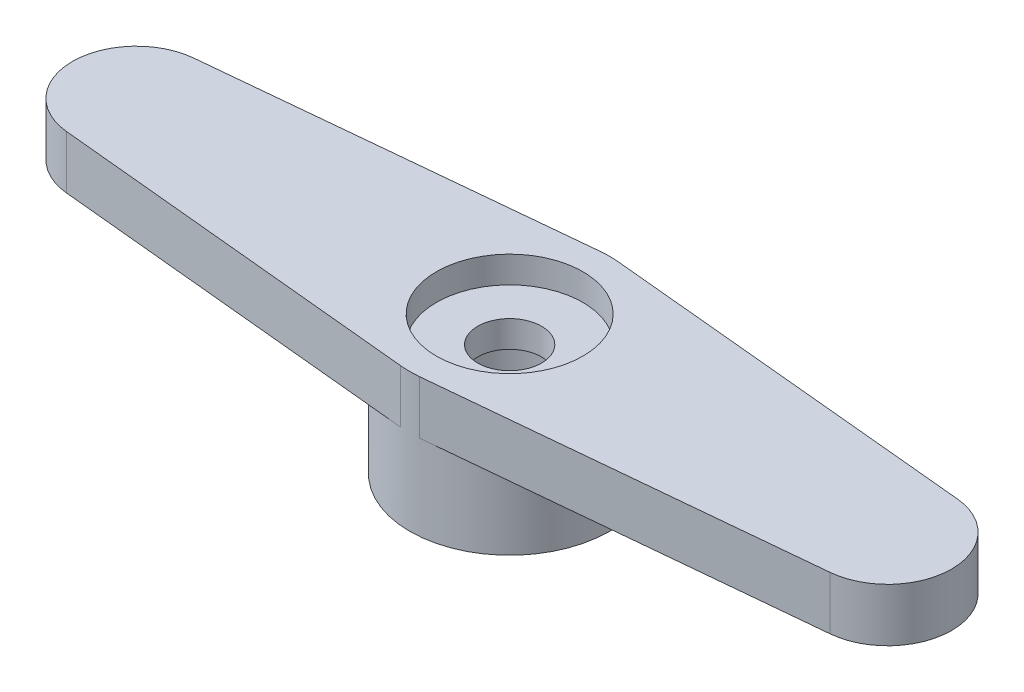
ISO-10303-21;
HEADER;
FILE_DESCRIPTION(('STEP AP214'),'2;1');
FILE_NAME('part.step','',(''),(''),'','','');
FILE_SCHEMA(('AUTOMOTIVE_DESIGN { 1 0 10303 214 1 1 1 1 }'));
ENDSEC;
DATA;
#1=APPLICATION_CONTEXT('core data for automotive mechanical design processes');
#2=APPLICATION_PROTOCOL_DEFINITION('international standard','automotive_design',2000,#1);
#3=PRODUCT_CONTEXT('',#1,'mechanical');
#4=PRODUCT('Part','Part','',(#3));
#5=PRODUCT_RELATED_PRODUCT_CATEGORY('part','',(#4));
#6=PRODUCT_DEFINITION_FORMATION('','',#4);
#7=PRODUCT_DEFINITION_CONTEXT('part definition',#1,'design');
#8=PRODUCT_DEFINITION('design','',#6,#7);
#9=PRODUCT_DEFINITION_SHAPE('','',#8);
#10=(LENGTH_UNIT() NAMED_UNIT(*) SI_UNIT(.MILLI.,.METRE.));
#11=(NAMED_UNIT(*) PLANE_ANGLE_UNIT() SI_UNIT($,.RADIAN.));
#12=(NAMED_UNIT(*) SI_UNIT($,.STERADIAN.) SOLID_ANGLE_UNIT());
#13=UNCERTAINTY_MEASURE_WITH_UNIT(LENGTH_MEASURE(1.E-05),#10,'distance_accuracy_value','');
#14=(GEOMETRIC_REPRESENTATION_CONTEXT(3) GLOBAL_UNCERTAINTY_ASSIGNED_CONTEXT((#13)) GLOBAL_UNIT_ASSIGNED_CONTEXT((#10,
#11,#12)) REPRESENTATION_CONTEXT('',''));
#15=CARTESIAN_POINT('',(0.,0.,0.));
#16=DIRECTION('',(0.,0.,1.));
#17=DIRECTION('',(1.,0.,0.));
#18=AXIS2_PLACEMENT_3D('',#15,#16,#17);
#19=CARTESIAN_POINT('',(0.,2.,0.));
#20=DIRECTION('',(0.,-1.,0.));
#21=DIRECTION('',(0.,0.,-1.));
#22=AXIS2_PLACEMENT_3D('',#19,#20,#21);
#23=CYLINDRICAL_SURFACE('',#22,1.2);
#24=CARTESIAN_POINT('',(0.,0.,0.));
#25=DIRECTION('',(0.,1.,0.));
#26=DIRECTION('',(0.,0.,1.));
#27=AXIS2_PLACEMENT_3D('',#24,#25,#26);
#28=CIRCLE('',#27,1.2);
#29=CARTESIAN_POINT('',(0.,0.,1.2));
#30=VERTEX_POINT('',#29);
#31=EDGE_CURVE('E184',#30,#30,#28,.T.);
#32=ORIENTED_EDGE('',*,*,#31,.F.);
#33=EDGE_LOOP('',(#32));
#34=FACE_BOUND('',#33,.T.);
#35=CARTESIAN_POINT('',(0.,1.,0.));
#36=DIRECTION('',(0.,1.,0.));
#37=DIRECTION('',(0.,0.,1.));
#38=AXIS2_PLACEMENT_3D('',#35,#36,#37);
#39=CIRCLE('',#38,1.2);
#40=CARTESIAN_POINT('',(0.,1.,1.2));
#41=VERTEX_POINT('',#40);
#42=EDGE_CURVE('E47',#41,#41,#39,.T.);
#43=ORIENTED_EDGE('',*,*,#42,.T.);
#44=EDGE_LOOP('',(#43));
#45=FACE_BOUND('',#44,.T.);
#46=ADVANCED_FACE('F43',(#34,#45),#23,.F.);
#47=CARTESIAN_POINT('',(14.2,0.,0.));
#48=DIRECTION('',(0.,1.,0.));
#49=DIRECTION('',(0.,0.,1.));
#50=AXIS2_PLACEMENT_3D('',#47,#48,#49);
#51=PLANE('',#50);
#52=CARTESIAN_POINT('',(0.,0.,0.));
#53=DIRECTION('',(0.,-1.,0.));
#54=DIRECTION('',(0.,0.,-1.));
#55=AXIS2_PLACEMENT_3D('',#52,#53,#54);
#56=CIRCLE('',#55,3.75);
#57=CARTESIAN_POINT('',(0.356514084507042,0.,-3.73301456031826));
#58=VERTEX_POINT('',#57);
#59=CARTESIAN_POINT('',(0.356514084507043,0.,3.73301456031826));
#60=VERTEX_POINT('',#59);
#61=EDGE_CURVE('E56',#58,#60,#56,.T.);
#62=ORIENTED_EDGE('',*,*,#61,.F.);
#63=DIRECTION('',(-0.995470549418202,0.,-0.0950704225352113));
#64=VECTOR('',#63,1.);
#65=CARTESIAN_POINT('',(0.356514084507042,0.,-3.73301456031826));
#66=LINE('',#65,#64);
#67=CARTESIAN_POINT('',(14.4281690140845,0.,-2.38912931860368));
#68=VERTEX_POINT('',#67);
#69=EDGE_CURVE('E151',#68,#58,#66,.T.);
#70=ORIENTED_EDGE('',*,*,#69,.F.);
#71=CARTESIAN_POINT('',(14.2,0.,0.));
#72=DIRECTION('',(0.,1.,0.));
#73=DIRECTION('',(0.,0.,1.));
#74=AXIS2_PLACEMENT_3D('',#71,#72,#73);
#75=CIRCLE('',#74,2.4);
#76=CARTESIAN_POINT('',(14.4281690140845,0.,2.38912931860368));
#77=VERTEX_POINT('',#76);
#78=EDGE_CURVE('E147',#77,#68,#75,.T.);
#79=ORIENTED_EDGE('',*,*,#78,.F.);
#80=DIRECTION('',(0.995470549418202,0.,-0.0950704225352114));
#81=VECTOR('',#80,1.);
#82=CARTESIAN_POINT('',(0.356514084507042,0.,3.73301456031826));
#83=LINE('',#82,#81);
#84=EDGE_CURVE('E91',#60,#77,#83,.T.);
#85=ORIENTED_EDGE('',*,*,#84,.F.);
#86=EDGE_LOOP('',(#62,#70,#79,#85));
#87=FACE_BOUND('',#86,.T.);
#88=ADVANCED_FACE('F234',(#87),#51,.F.);
#89=CARTESIAN_POINT('',(-0.360998998004985,0.,3.73258351861541));
#90=VERTEX_POINT('',#89);
#91=CARTESIAN_POINT('',(-0.360998998004984,0.,-3.73258351861541));
#92=VERTEX_POINT('',#91);
#93=EDGE_CURVE('E11',#90,#92,#56,.T.);
#94=ORIENTED_EDGE('',*,*,#93,.F.);
#95=DIRECTION('',(0.995355604964109,0.,0.096266399467996));
#96=VECTOR('',#95,1.);
#97=CARTESIAN_POINT('',(-0.360998998004985,0.,3.73258351861541));
#98=LINE('',#97,#96);
#99=CARTESIAN_POINT('',(-14.2546239890885,0.,2.38885345191386));
#100=VERTEX_POINT('',#99);
#101=EDGE_CURVE('E131',#100,#90,#98,.T.);
#102=ORIENTED_EDGE('',*,*,#101,.F.);
#103=CARTESIAN_POINT('',(-14.0235846303653,0.,0.));
#104=DIRECTION('',(0.,1.,0.));
#105=DIRECTION('',(0.,0.,1.));
#106=AXIS2_PLACEMENT_3D('',#103,#104,#105);
#107=CIRCLE('',#106,2.4);
#108=CARTESIAN_POINT('',(-14.2546239890885,0.,-2.38885345191386));
#109=VERTEX_POINT('',#108);
#110=EDGE_CURVE('E84',#109,#100,#107,.T.);
#111=ORIENTED_EDGE('',*,*,#110,.F.);
#112=DIRECTION('',(-0.995355604964109,0.,0.0962663994679961));
#113=VECTOR('',#112,1.);
#114=CARTESIAN_POINT('',(-14.2546239890885,0.,-2.38885345191386));
#115=LINE('',#114,#113);
#116=EDGE_CURVE('E156',#92,#109,#115,.T.);
#117=ORIENTED_EDGE('',*,*,#116,.F.);
#118=EDGE_LOOP('',(#94,#102,#111,#117));
#119=FACE_BOUND('',#118,.T.);
#120=ADVANCED_FACE('F225',(#119),#51,.F.);
#121=CARTESIAN_POINT('',(14.2,2.,0.));
#122=DIRECTION('',(0.,1.,0.));
#123=DIRECTION('',(0.,0.,1.));
#124=AXIS2_PLACEMENT_3D('',#121,#122,#123);
#125=PLANE('',#124);
#126=CARTESIAN_POINT('',(0.,2.,0.));
#127=DIRECTION('',(0.,1.,0.));
#128=DIRECTION('',(0.,0.,1.));
#129=AXIS2_PLACEMENT_3D('',#126,#127,#128);
#130=CIRCLE('',#129,2.75);
#131=CARTESIAN_POINT('',(0.,2.,2.75));
#132=VERTEX_POINT('',#131);
#133=EDGE_CURVE('E267',#132,#132,#130,.T.);
#134=ORIENTED_EDGE('',*,*,#133,.F.);
#135=EDGE_LOOP('',(#134));
#136=FACE_BOUND('',#135,.T.);
#137=CARTESIAN_POINT('',(14.2,2.,0.));
#138=DIRECTION('',(0.,1.,0.));
#139=DIRECTION('',(0.,0.,1.));
#140=AXIS2_PLACEMENT_3D('',#137,#138,#139);
#141=CIRCLE('',#140,2.4);
#142=CARTESIAN_POINT('',(14.4281690140845,2.,2.38912931860368));
#143=VERTEX_POINT('',#142);
#144=CARTESIAN_POINT('',(14.4281690140845,2.,-2.38912931860368));
#145=VERTEX_POINT('',#144);
#146=EDGE_CURVE('E165',#143,#145,#141,.T.);
#147=ORIENTED_EDGE('',*,*,#146,.T.);
#148=DIRECTION('',(-0.995470549418202,0.,-0.0950704225352113));
#149=VECTOR('',#148,1.);
#150=CARTESIAN_POINT('',(0.356514084507042,2.,-3.73301456031826));
#151=LINE('',#150,#149);
#152=CARTESIAN_POINT('',(0.356514084507042,2.,-3.73301456031826));
#153=VERTEX_POINT('',#152);
#154=EDGE_CURVE('E100',#145,#153,#151,.T.);
#155=ORIENTED_EDGE('',*,*,#154,.T.);
#156=CARTESIAN_POINT('',(0.,2.,0.));
#157=DIRECTION('',(0.,1.,0.));
#158=DIRECTION('',(0.,0.,1.));
#159=AXIS2_PLACEMENT_3D('',#156,#157,#158);
#160=CIRCLE('',#159,3.75);
#161=CARTESIAN_POINT('',(-0.360998998004984,2.,-3.73258351861541));
#162=VERTEX_POINT('',#161);
#163=EDGE_CURVE('E209',#153,#162,#160,.T.);
#164=ORIENTED_EDGE('',*,*,#163,.T.);
#165=DIRECTION('',(-0.995355604964109,0.,0.0962663994679961));
#166=VECTOR('',#165,1.);
#167=CARTESIAN_POINT('',(-14.2546239890885,2.,-2.38885345191386));
#168=LINE('',#167,#166);
#169=CARTESIAN_POINT('',(-14.2546239890885,2.,-2.38885345191386));
#170=VERTEX_POINT('',#169);
#171=EDGE_CURVE('E212',#162,#170,#168,.T.);
#172=ORIENTED_EDGE('',*,*,#171,.T.);
#173=CARTESIAN_POINT('',(-14.0235846303653,2.,0.));
#174=DIRECTION('',(0.,1.,0.));
#175=DIRECTION('',(0.,0.,1.));
#176=AXIS2_PLACEMENT_3D('',#173,#174,#175);
#177=CIRCLE('',#176,2.4);
#178=CARTESIAN_POINT('',(-14.2546239890885,2.,2.38885345191386));
#179=VERTEX_POINT('',#178);
#180=EDGE_CURVE('E122',#170,#179,#177,.T.);
#181=ORIENTED_EDGE('',*,*,#180,.T.);
#182=DIRECTION('',(0.995355604964109,0.,0.096266399467996));
#183=VECTOR('',#182,1.);
#184=CARTESIAN_POINT('',(-0.360998998004985,2.,3.73258351861541));
#185=LINE('',#184,#183);
#186=CARTESIAN_POINT('',(-0.360998998004985,2.,3.73258351861541));
#187=VERTEX_POINT('',#186);
#188=EDGE_CURVE('E115',#179,#187,#185,.T.);
#189=ORIENTED_EDGE('',*,*,#188,.T.);
#190=CARTESIAN_POINT('',(0.,2.,0.));
#191=DIRECTION('',(0.,1.,0.));
#192=DIRECTION('',(0.,0.,1.));
#193=AXIS2_PLACEMENT_3D('',#190,#191,#192);
#194=CIRCLE('',#193,3.75);
#195=CARTESIAN_POINT('',(0.356514084507044,2.,3.73301456031826));
#196=VERTEX_POINT('',#195);
#197=EDGE_CURVE('E119',#187,#196,#194,.T.);
#198=ORIENTED_EDGE('',*,*,#197,.T.);
#199=DIRECTION('',(0.995470549418202,0.,-0.0950704225352114));
#200=VECTOR('',#199,1.);
#201=CARTESIAN_POINT('',(0.356514084507042,2.,3.73301456031826));
#202=LINE('',#201,#200);
#203=EDGE_CURVE('E64',#196,#143,#202,.T.);
#204=ORIENTED_EDGE('',*,*,#203,.T.);
#205=EDGE_LOOP('',(#147,#155,#164,#172,#181,#189,#198,#204));
#206=FACE_BOUND('',#205,.T.);
#207=ADVANCED_FACE('F117',(#136,#206),#125,.T.);
#208=CARTESIAN_POINT('',(14.2,2.,0.));
#209=DIRECTION('',(0.,-1.,0.));
#210=DIRECTION('',(0.,0.,-1.));
#211=AXIS2_PLACEMENT_3D('',#208,#209,#210);
#212=CYLINDRICAL_SURFACE('',#211,2.4);
#213=ORIENTED_EDGE('',*,*,#78,.T.);
#214=DIRECTION('',(0.,-1.,0.));
#215=VECTOR('',#214,1.);
#216=CARTESIAN_POINT('',(14.4281690140845,2.,-2.38912931860368));
#217=LINE('',#216,#215);
#218=EDGE_CURVE('E54',#145,#68,#217,.T.);
#219=ORIENTED_EDGE('',*,*,#218,.F.);
#220=ORIENTED_EDGE('',*,*,#146,.F.);
#221=DIRECTION('',(0.,-1.,0.));
#222=VECTOR('',#221,1.);
#223=CARTESIAN_POINT('',(14.4281690140845,2.,2.38912931860368));
#224=LINE('',#223,#222);
#225=EDGE_CURVE('E143',#143,#77,#224,.T.);
#226=ORIENTED_EDGE('',*,*,#225,.T.);
#227=EDGE_LOOP('',(#213,#219,#220,#226));
#228=FACE_BOUND('',#227,.T.);
#229=ADVANCED_FACE('F45',(#228),#212,.T.);
#230=CARTESIAN_POINT('',(0.356514084507042,2.,-3.73301456031826));
#231=DIRECTION('',(-0.0950704225352113,0.,0.995470549418202));
#232=DIRECTION('',(0.995470549418202,0.,0.0950704225352113));
#233=AXIS2_PLACEMENT_3D('',#230,#231,#232);
#234=PLANE('',#233);
#235=ORIENTED_EDGE('',*,*,#69,.T.);
#236=DIRECTION('',(0.,-1.,0.));
#237=VECTOR('',#236,1.);
#238=CARTESIAN_POINT('',(0.356514084507042,2.,-3.73301456031826));
#239=LINE('',#238,#237);
#240=EDGE_CURVE('E179',#153,#58,#239,.T.);
#241=ORIENTED_EDGE('',*,*,#240,.F.);
#242=ORIENTED_EDGE('',*,*,#154,.F.);
#243=ORIENTED_EDGE('',*,*,#218,.T.);
#244=EDGE_LOOP('',(#235,#241,#242,#243));
#245=FACE_BOUND('',#244,.T.);
#246=ADVANCED_FACE('F230',(#245),#234,.F.);
#247=CARTESIAN_POINT('',(-14.2546239890885,2.,-2.38885345191386));
#248=DIRECTION('',(0.0962663994679961,0.,0.995355604964109));
#249=DIRECTION('',(0.995355604964109,0.,-0.0962663994679961));
#250=AXIS2_PLACEMENT_3D('',#247,#248,#249);
#251=PLANE('',#250);
#252=ORIENTED_EDGE('',*,*,#116,.T.);
#253=DIRECTION('',(0.,-1.,0.));
#254=VECTOR('',#253,1.);
#255=CARTESIAN_POINT('',(-14.2546239890885,2.,-2.38885345191386));
#256=LINE('',#255,#254);
#257=EDGE_CURVE('E172',#170,#109,#256,.T.);
#258=ORIENTED_EDGE('',*,*,#257,.F.);
#259=ORIENTED_EDGE('',*,*,#171,.F.);
#260=DIRECTION('',(0.,-1.,0.));
#261=VECTOR('',#260,1.);
#262=CARTESIAN_POINT('',(-0.360998998004984,2.,-3.73258351861541));
#263=LINE('',#262,#261);
#264=EDGE_CURVE('E175',#162,#92,#263,.T.);
#265=ORIENTED_EDGE('',*,*,#264,.T.);
#266=EDGE_LOOP('',(#252,#258,#259,#265));
#267=FACE_BOUND('',#266,.T.);
#268=ADVANCED_FACE('F220',(#267),#251,.F.);
#269=CARTESIAN_POINT('',(-14.0235846303653,2.,0.));
#270=DIRECTION('',(0.,-1.,0.));
#271=DIRECTION('',(0.,0.,-1.));
#272=AXIS2_PLACEMENT_3D('',#269,#270,#271);
#273=CYLINDRICAL_SURFACE('',#272,2.4);
#274=ORIENTED_EDGE('',*,*,#110,.T.);
#275=DIRECTION('',(0.,-1.,0.));
#276=VECTOR('',#275,1.);
#277=CARTESIAN_POINT('',(-14.2546239890885,2.,2.38885345191386));
#278=LINE('',#277,#276);
#279=EDGE_CURVE('E134',#179,#100,#278,.T.);
#280=ORIENTED_EDGE('',*,*,#279,.F.);
#281=ORIENTED_EDGE('',*,*,#180,.F.);
#282=ORIENTED_EDGE('',*,*,#257,.T.);
#283=EDGE_LOOP('',(#274,#280,#281,#282));
#284=FACE_BOUND('',#283,.T.);
#285=ADVANCED_FACE('F222',(#284),#273,.T.);
#286=CARTESIAN_POINT('',(-0.360998998004985,2.,3.73258351861541));
#287=DIRECTION('',(0.096266399467996,0.,-0.995355604964109));
#288=DIRECTION('',(-0.995355604964109,0.,-0.096266399467996));
#289=AXIS2_PLACEMENT_3D('',#286,#287,#288);
#290=PLANE('',#289);
#291=ORIENTED_EDGE('',*,*,#101,.T.);
#292=DIRECTION('',(0.,-1.,0.));
#293=VECTOR('',#292,1.);
#294=CARTESIAN_POINT('',(-0.360998998004985,2.,3.73258351861541));
#295=LINE('',#294,#293);
#296=EDGE_CURVE('E128',#187,#90,#295,.T.);
#297=ORIENTED_EDGE('',*,*,#296,.F.);
#298=ORIENTED_EDGE('',*,*,#188,.F.);
#299=ORIENTED_EDGE('',*,*,#279,.T.);
#300=EDGE_LOOP('',(#291,#297,#298,#299));
#301=FACE_BOUND('',#300,.T.);
#302=ADVANCED_FACE('F129',(#301),#290,.F.);
#303=CARTESIAN_POINT('',(0.,2.,0.));
#304=DIRECTION('',(0.,-1.,0.));
#305=DIRECTION('',(0.,0.,-1.));
#306=AXIS2_PLACEMENT_3D('',#303,#304,#305);
#307=CYLINDRICAL_SURFACE('',#306,3.75);
#308=ORIENTED_EDGE('',*,*,#296,.T.);
#309=ORIENTED_EDGE('',*,*,#93,.T.);
#310=ORIENTED_EDGE('',*,*,#264,.F.);
#311=ORIENTED_EDGE('',*,*,#163,.F.);
#312=ORIENTED_EDGE('',*,*,#240,.T.);
#313=ORIENTED_EDGE('',*,*,#61,.T.);
#314=DIRECTION('',(0.,-1.,0.));
#315=VECTOR('',#314,1.);
#316=CARTESIAN_POINT('',(0.356514084507044,2.,3.73301456031826));
#317=LINE('',#316,#315);
#318=EDGE_CURVE('E135',#196,#60,#317,.T.);
#319=ORIENTED_EDGE('',*,*,#318,.F.);
#320=ORIENTED_EDGE('',*,*,#197,.F.);
#321=EDGE_LOOP('',(#308,#309,#310,#311,#312,#313,#319,#320));
#322=FACE_BOUND('',#321,.T.);
#323=CARTESIAN_POINT('',(0.,-3.2,0.));
#324=DIRECTION('',(0.,-1.,0.));
#325=DIRECTION('',(0.,0.,-1.));
#326=AXIS2_PLACEMENT_3D('',#323,#324,#325);
#327=CIRCLE('',#326,3.75);
#328=CARTESIAN_POINT('',(0.,-3.2,-3.75));
#329=VERTEX_POINT('',#328);
#330=EDGE_CURVE('E152',#329,#329,#327,.T.);
#331=ORIENTED_EDGE('',*,*,#330,.F.);
#332=EDGE_LOOP('',(#331));
#333=FACE_BOUND('',#332,.T.);
#334=ADVANCED_FACE('F137',(#322,#333),#307,.T.);
#335=CARTESIAN_POINT('',(0.356514084507042,2.,3.73301456031826));
#336=DIRECTION('',(-0.0950704225352114,0.,-0.995470549418202));
#337=DIRECTION('',(-0.995470549418202,0.,0.0950704225352114));
#338=AXIS2_PLACEMENT_3D('',#335,#336,#337);
#339=PLANE('',#338);
#340=ORIENTED_EDGE('',*,*,#84,.T.);
#341=ORIENTED_EDGE('',*,*,#225,.F.);
#342=ORIENTED_EDGE('',*,*,#203,.F.);
#343=ORIENTED_EDGE('',*,*,#318,.T.);
#344=EDGE_LOOP('',(#340,#341,#342,#343));
#345=FACE_BOUND('',#344,.T.);
#346=ADVANCED_FACE('F237',(#345),#339,.F.);
#347=CARTESIAN_POINT('',(0.,-3.2,0.));
#348=DIRECTION('',(0.,-1.,0.));
#349=DIRECTION('',(0.,0.,-1.));
#350=AXIS2_PLACEMENT_3D('',#347,#348,#349);
#351=PLANE('',#350);
#352=CARTESIAN_POINT('',(0.,-3.2,0.));
#353=DIRECTION('',(0.,-1.,0.));
#354=DIRECTION('',(0.,0.,-1.));
#355=AXIS2_PLACEMENT_3D('',#352,#353,#354);
#356=CIRCLE('',#355,2.4);
#357=CARTESIAN_POINT('',(0.,-3.2,-2.4));
#358=VERTEX_POINT('',#357);
#359=EDGE_CURVE('E193',#358,#358,#356,.T.);
#360=ORIENTED_EDGE('',*,*,#359,.F.);
#361=EDGE_LOOP('',(#360));
#362=FACE_BOUND('',#361,.T.);
#363=ORIENTED_EDGE('',*,*,#330,.T.);
#364=EDGE_LOOP('',(#363));
#365=FACE_BOUND('',#364,.T.);
#366=ADVANCED_FACE('F239',(#362,#365),#351,.T.);
#367=CARTESIAN_POINT('',(14.2,0.,0.));
#368=DIRECTION('',(0.,1.,0.));
#369=DIRECTION('',(0.,0.,1.));
#370=AXIS2_PLACEMENT_3D('',#367,#368,#369);
#371=PLANE('',#370);
#372=ORIENTED_EDGE('',*,*,#31,.T.);
#373=EDGE_LOOP('',(#372));
#374=FACE_BOUND('',#373,.T.);
#375=CARTESIAN_POINT('',(0.,0.,0.));
#376=DIRECTION('',(0.,1.,0.));
#377=DIRECTION('',(0.,0.,1.));
#378=AXIS2_PLACEMENT_3D('',#375,#376,#377);
#379=CIRCLE('',#378,2.4);
#380=CARTESIAN_POINT('',(0.,0.,-2.4));
#381=VERTEX_POINT('',#380);
#382=EDGE_CURVE('E187',#381,#381,#379,.F.);
#383=ORIENTED_EDGE('',*,*,#382,.T.);
#384=EDGE_LOOP('',(#383));
#385=FACE_BOUND('',#384,.T.);
#386=ADVANCED_FACE('F245',(#374,#385),#371,.F.);
#387=CARTESIAN_POINT('',(0.,6.78822509939086,0.));
#388=DIRECTION('',(0.,-1.,0.));
#389=DIRECTION('',(0.,0.,-1.));
#390=AXIS2_PLACEMENT_3D('',#387,#388,#389);
#391=CYLINDRICAL_SURFACE('',#390,2.4);
#392=CARTESIAN_POINT('',(0.,-3.2,-2.4));
#393=CARTESIAN_POINT('',(0.,-3.16666666666667,-2.4));
#394=CARTESIAN_POINT('',(0.,-3.13333333333334,-2.4));
#395=CARTESIAN_POINT('',(0.,-3.06666666666667,-2.4));
#396=CARTESIAN_POINT('',(0.,-3.03333333333333,-2.4));
#397=CARTESIAN_POINT('',(0.,-2.96666666666667,-2.4));
#398=CARTESIAN_POINT('',(0.,-2.93333333333333,-2.4));
#399=CARTESIAN_POINT('',(0.,-2.86666666666667,-2.4));
#400=CARTESIAN_POINT('',(0.,-2.83333333333333,-2.4));
#401=CARTESIAN_POINT('',(0.,-2.76666666666667,-2.4));
#402=CARTESIAN_POINT('',(0.,-2.73333333333333,-2.4));
#403=CARTESIAN_POINT('',(0.,-2.66666666666667,-2.4));
#404=CARTESIAN_POINT('',(0.,-2.63333333333333,-2.4));
#405=CARTESIAN_POINT('',(0.,-2.56666666666667,-2.4));
#406=CARTESIAN_POINT('',(0.,-2.53333333333333,-2.4));
#407=CARTESIAN_POINT('',(0.,-2.46666666666667,-2.4));
#408=CARTESIAN_POINT('',(0.,-2.43333333333333,-2.4));
#409=CARTESIAN_POINT('',(0.,-2.36666666666667,-2.4));
#410=CARTESIAN_POINT('',(0.,-2.33333333333333,-2.4));
#411=CARTESIAN_POINT('',(0.,-2.26666666666667,-2.4));
#412=CARTESIAN_POINT('',(0.,-2.23333333333333,-2.4));
#413=CARTESIAN_POINT('',(0.,-2.16666666666667,-2.4));
#414=CARTESIAN_POINT('',(0.,-2.13333333333333,-2.4));
#415=CARTESIAN_POINT('',(0.,-2.06666666666667,-2.4));
#416=CARTESIAN_POINT('',(0.,-2.03333333333333,-2.4));
#417=CARTESIAN_POINT('',(0.,-1.96666666666667,-2.4));
#418=CARTESIAN_POINT('',(0.,-1.93333333333333,-2.4));
#419=CARTESIAN_POINT('',(0.,-1.86666666666667,-2.4));
#420=CARTESIAN_POINT('',(0.,-1.83333333333333,-2.4));
#421=CARTESIAN_POINT('',(0.,-1.76666666666667,-2.4));
#422=CARTESIAN_POINT('',(0.,-1.73333333333333,-2.4));
#423=CARTESIAN_POINT('',(0.,-1.66666666666667,-2.4));
#424=CARTESIAN_POINT('',(0.,-1.63333333333333,-2.4));
#425=CARTESIAN_POINT('',(0.,-1.56666666666667,-2.4));
#426=CARTESIAN_POINT('',(0.,-1.53333333333333,-2.4));
#427=CARTESIAN_POINT('',(0.,-1.46666666666667,-2.4));
#428=CARTESIAN_POINT('',(0.,-1.43333333333333,-2.4));
#429=CARTESIAN_POINT('',(0.,-1.36666666666667,-2.4));
#430=CARTESIAN_POINT('',(0.,-1.33333333333333,-2.4));
#431=CARTESIAN_POINT('',(0.,-1.26666666666667,-2.4));
#432=CARTESIAN_POINT('',(0.,-1.23333333333333,-2.4));
#433=CARTESIAN_POINT('',(0.,-1.16666666666667,-2.4));
#434=CARTESIAN_POINT('',(0.,-1.13333333333333,-2.4));
#435=CARTESIAN_POINT('',(0.,-1.06666666666667,-2.4));
#436=CARTESIAN_POINT('',(0.,-1.03333333333333,-2.4));
#437=CARTESIAN_POINT('',(0.,-0.966666666666668,-2.4));
#438=CARTESIAN_POINT('',(0.,-0.933333333333335,-2.4));
#439=CARTESIAN_POINT('',(0.,-0.866666666666668,-2.4));
#440=CARTESIAN_POINT('',(0.,-0.833333333333335,-2.4));
#441=CARTESIAN_POINT('',(0.,-0.766666666666668,-2.4));
#442=CARTESIAN_POINT('',(0.,-0.733333333333334,-2.4));
#443=CARTESIAN_POINT('',(0.,-0.666666666666668,-2.4));
#444=CARTESIAN_POINT('',(0.,-0.633333333333334,-2.4));
#445=CARTESIAN_POINT('',(0.,-0.566666666666668,-2.4));
#446=CARTESIAN_POINT('',(0.,-0.533333333333334,-2.4));
#447=CARTESIAN_POINT('',(0.,-0.466666666666668,-2.4));
#448=CARTESIAN_POINT('',(0.,-0.433333333333334,-2.4));
#449=CARTESIAN_POINT('',(0.,-0.366666666666668,-2.4));
#450=CARTESIAN_POINT('',(0.,-0.333333333333334,-2.4));
#451=CARTESIAN_POINT('',(0.,-0.266666666666668,-2.4));
#452=CARTESIAN_POINT('',(0.,-0.233333333333335,-2.4));
#453=CARTESIAN_POINT('',(0.,-0.166666666666668,-2.4));
#454=CARTESIAN_POINT('',(0.,-0.133333333333335,-2.4));
#455=CARTESIAN_POINT('',(0.,-0.0666666666666677,-2.4));
#456=CARTESIAN_POINT('',(0.,-0.0333333333333342,-2.4));
#457=CARTESIAN_POINT('',(0.,0.,-2.4));
#458=B_SPLINE_CURVE_WITH_KNOTS('',3,(#392,#393,#394,#395,#396,#397,#398,#399,#400,#401,#402,
#403,#404,#405,#406,#407,#408,#409,#410,#411,#412,#413,#414,#415,#416,#417,#418,#419,#420,#421,
#422,#423,#424,#425,#426,#427,#428,#429,#430,#431,#432,#433,#434,#435,#436,#437,#438,#439,#440,
#441,#442,#443,#444,#445,#446,#447,#448,#449,#450,#451,#452,#453,#454,#455,#456,#457),
.UNSPECIFIED.,.F.,.F.,(4,2,2,2,2,2,2,2,2,2,2,2,2,2,2,2,2,2,2,2,2,2,2,2,2,2,2,2,2,2,2,2,4),(0.,
0.0999999999999994,0.200000000000001,0.3,0.400000000000001,0.5,0.6,0.700000000000001,0.8,0.9,1.,
1.1,1.2,1.3,1.4,1.5,1.6,1.7,1.8,1.9,2.,2.1,2.2,2.3,2.4,2.5,2.6,2.7,2.8,2.9,3.,3.1,3.2),.UNSPECIFIED.);
#459=EDGE_CURVE('BSEAM287',#358,#381,#458,.T.);
#460=ORIENTED_EDGE('',*,*,#359,.T.);
#461=ORIENTED_EDGE('',*,*,#382,.F.);
#462=ORIENTED_EDGE('',*,*,#459,.T.);
#463=ORIENTED_EDGE('',*,*,#459,.F.);
#464=EDGE_LOOP('',(#460,#462,#461,#463));
#465=FACE_BOUND('',#464,.T.);
#466=ADVANCED_FACE('F287',(#465),#391,.F.);
#467=CARTESIAN_POINT('',(0.,1.,0.));
#468=DIRECTION('',(0.,1.,0.));
#469=DIRECTION('',(0.,0.,1.));
#470=AXIS2_PLACEMENT_3D('',#467,#468,#469);
#471=CYLINDRICAL_SURFACE('',#470,2.75);
#472=CARTESIAN_POINT('',(0.,1.,0.));
#473=DIRECTION('',(0.,1.,0.));
#474=DIRECTION('',(0.,0.,1.));
#475=AXIS2_PLACEMENT_3D('',#472,#473,#474);
#476=CIRCLE('',#475,2.75);
#477=CARTESIAN_POINT('',(0.,1.,2.75));
#478=VERTEX_POINT('',#477);
#479=EDGE_CURVE('E270',#478,#478,#476,.T.);
#480=ORIENTED_EDGE('',*,*,#479,.F.);
#481=EDGE_LOOP('',(#480));
#482=FACE_BOUND('',#481,.T.);
#483=ORIENTED_EDGE('',*,*,#133,.T.);
#484=EDGE_LOOP('',(#483));
#485=FACE_BOUND('',#484,.T.);
#486=ADVANCED_FACE('F282',(#482,#485),#471,.F.);
#487=CARTESIAN_POINT('',(0.,1.,0.));
#488=DIRECTION('',(0.,1.,0.));
#489=DIRECTION('',(0.,0.,1.));
#490=AXIS2_PLACEMENT_3D('',#487,#488,#489);
#491=PLANE('',#490);
#492=ORIENTED_EDGE('',*,*,#42,.F.);
#493=EDGE_LOOP('',(#492));
#494=FACE_BOUND('',#493,.T.);
#495=ORIENTED_EDGE('',*,*,#479,.T.);
#496=EDGE_LOOP('',(#495));
#497=FACE_BOUND('',#496,.T.);
#498=ADVANCED_FACE('F280',(#494,#497),#491,.T.);
#499=CLOSED_SHELL('',(#46,#88,#120,#207,#229,#246,#268,#285,#302,#334,#346,#366,#386,#466,#486,#498));
#500=MANIFOLD_SOLID_BREP('B2',#499);
#501=ADVANCED_BREP_SHAPE_REPRESENTATION('',(#18,#500),#14);
#502=SHAPE_DEFINITION_REPRESENTATION(#9,#501);
ENDSEC;
END-ISO-10303-21;
